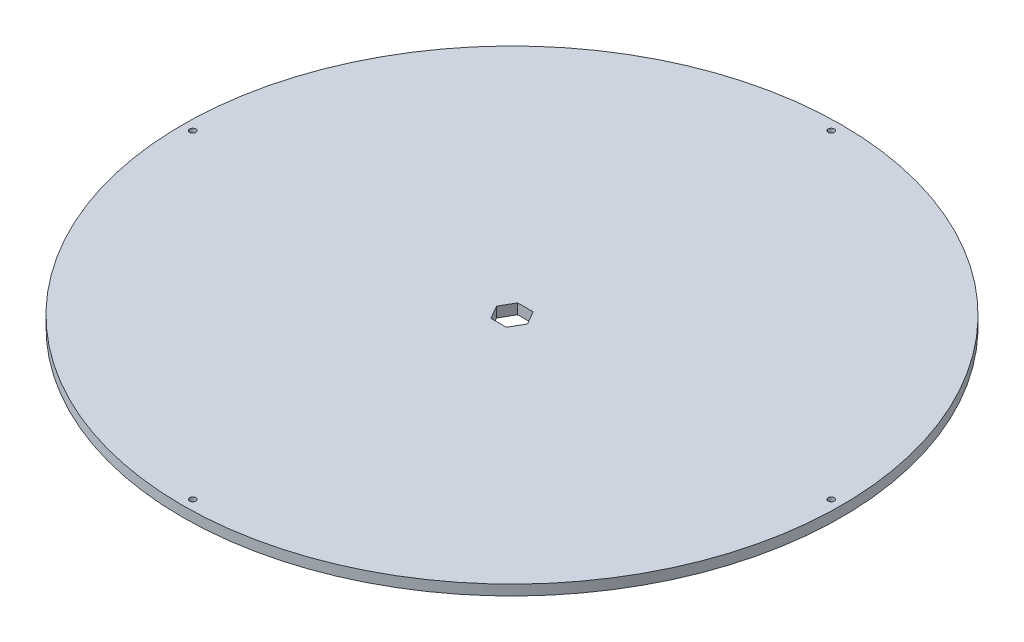
ISO-10303-21;
HEADER;
FILE_DESCRIPTION(('STEP AP214'),'2;1');
FILE_NAME('part.step','',(''),(''),'','','');
FILE_SCHEMA(('AUTOMOTIVE_DESIGN { 1 0 10303 214 1 1 1 1 }'));
ENDSEC;
DATA;
#1=APPLICATION_CONTEXT('core data for automotive mechanical design processes');
#2=APPLICATION_PROTOCOL_DEFINITION('international standard','automotive_design',2000,#1);
#3=PRODUCT_CONTEXT('',#1,'mechanical');
#4=PRODUCT('Part','Part','',(#3));
#5=PRODUCT_RELATED_PRODUCT_CATEGORY('part','',(#4));
#6=PRODUCT_DEFINITION_FORMATION('','',#4);
#7=PRODUCT_DEFINITION_CONTEXT('part definition',#1,'design');
#8=PRODUCT_DEFINITION('design','',#6,#7);
#9=PRODUCT_DEFINITION_SHAPE('','',#8);
#10=(LENGTH_UNIT() NAMED_UNIT(*) SI_UNIT(.MILLI.,.METRE.));
#11=(NAMED_UNIT(*) PLANE_ANGLE_UNIT() SI_UNIT($,.RADIAN.));
#12=(NAMED_UNIT(*) SI_UNIT($,.STERADIAN.) SOLID_ANGLE_UNIT());
#13=UNCERTAINTY_MEASURE_WITH_UNIT(LENGTH_MEASURE(1.E-05),#10,'distance_accuracy_value','');
#14=(GEOMETRIC_REPRESENTATION_CONTEXT(3) GLOBAL_UNCERTAINTY_ASSIGNED_CONTEXT((#13)) GLOBAL_UNIT_ASSIGNED_CONTEXT((#10,
#11,#12)) REPRESENTATION_CONTEXT('',''));
#15=CARTESIAN_POINT('',(0.,0.,0.));
#16=DIRECTION('',(0.,0.,1.));
#17=DIRECTION('',(1.,0.,0.));
#18=AXIS2_PLACEMENT_3D('',#15,#16,#17);
#19=CARTESIAN_POINT('',(0.,-5.,0.));
#20=DIRECTION('',(0.,1.,0.));
#21=DIRECTION('',(0.,0.,1.));
#22=AXIS2_PLACEMENT_3D('',#19,#20,#21);
#23=CYLINDRICAL_SURFACE('',#22,160.);
#24=CARTESIAN_POINT('',(0.,-5.,0.));
#25=DIRECTION('',(0.,1.,0.));
#26=DIRECTION('',(0.,0.,1.));
#27=AXIS2_PLACEMENT_3D('',#24,#25,#26);
#28=CIRCLE('',#27,160.);
#29=CARTESIAN_POINT('',(0.,-5.,160.));
#30=VERTEX_POINT('',#29);
#31=EDGE_CURVE('E11',#30,#30,#28,.T.);
#32=ORIENTED_EDGE('',*,*,#31,.T.);
#33=EDGE_LOOP('',(#32));
#34=FACE_BOUND('',#33,.T.);
#35=CARTESIAN_POINT('',(0.,0.,0.));
#36=DIRECTION('',(0.,1.,0.));
#37=DIRECTION('',(0.,0.,1.));
#38=AXIS2_PLACEMENT_3D('',#35,#36,#37);
#39=CIRCLE('',#38,160.);
#40=CARTESIAN_POINT('',(0.,0.,160.));
#41=VERTEX_POINT('',#40);
#42=EDGE_CURVE('E38',#41,#41,#39,.T.);
#43=ORIENTED_EDGE('',*,*,#42,.F.);
#44=EDGE_LOOP('',(#43));
#45=FACE_BOUND('',#44,.T.);
#46=ADVANCED_FACE('F35',(#34,#45),#23,.T.);
#47=CARTESIAN_POINT('',(0.,-5.,0.));
#48=DIRECTION('',(0.,1.,0.));
#49=DIRECTION('',(0.,0.,1.));
#50=AXIS2_PLACEMENT_3D('',#47,#48,#49);
#51=PLANE('',#50);
#52=CARTESIAN_POINT('',(1.62353882256206E-12,-5.,-155.));
#53=DIRECTION('',(0.,1.,0.));
#54=DIRECTION('',(0.,0.,1.));
#55=AXIS2_PLACEMENT_3D('',#52,#53,#54);
#56=CIRCLE('',#55,1.49999999999999);
#57=CARTESIAN_POINT('',(1.62353882256206E-12,-5.,-153.5));
#58=VERTEX_POINT('',#57);
#59=EDGE_CURVE('E210',#58,#58,#56,.T.);
#60=ORIENTED_EDGE('',*,*,#59,.T.);
#61=EDGE_LOOP('',(#60));
#62=FACE_BOUND('',#61,.T.);
#63=CARTESIAN_POINT('',(-155.,-5.,-1.08235921504137E-12));
#64=DIRECTION('',(0.,1.,0.));
#65=DIRECTION('',(0.,0.,1.));
#66=AXIS2_PLACEMENT_3D('',#63,#64,#65);
#67=CIRCLE('',#66,1.49999999999999);
#68=CARTESIAN_POINT('',(-155.,-5.,1.49999999999891));
#69=VERTEX_POINT('',#68);
#70=EDGE_CURVE('E218',#69,#69,#67,.T.);
#71=ORIENTED_EDGE('',*,*,#70,.T.);
#72=EDGE_LOOP('',(#71));
#73=FACE_BOUND('',#72,.T.);
#74=CARTESIAN_POINT('',(-5.41179607520686E-13,-5.,155.));
#75=DIRECTION('',(0.,1.,0.));
#76=DIRECTION('',(0.,0.,1.));
#77=AXIS2_PLACEMENT_3D('',#74,#75,#76);
#78=CIRCLE('',#77,1.5);
#79=CARTESIAN_POINT('',(-5.41179607520686E-13,-5.,156.5));
#80=VERTEX_POINT('',#79);
#81=EDGE_CURVE('E124',#80,#80,#78,.T.);
#82=ORIENTED_EDGE('',*,*,#81,.T.);
#83=EDGE_LOOP('',(#82));
#84=FACE_BOUND('',#83,.T.);
#85=DIRECTION('',(1.,0.,0.));
#86=VECTOR('',#85,1.);
#87=CARTESIAN_POINT('',(-3.75277674973257,-5.,6.5));
#88=LINE('',#87,#86);
#89=CARTESIAN_POINT('',(-3.75277674973257,-5.,6.5));
#90=VERTEX_POINT('',#89);
#91=CARTESIAN_POINT('',(3.75277674973256,-5.,6.5));
#92=VERTEX_POINT('',#91);
#93=EDGE_CURVE('E95',#90,#92,#88,.T.);
#94=ORIENTED_EDGE('',*,*,#93,.T.);
#95=DIRECTION('',(0.499999999999999,0.,-0.866025403784439));
#96=VECTOR('',#95,1.);
#97=CARTESIAN_POINT('',(3.75277674973256,-5.,6.5));
#98=LINE('',#97,#96);
#99=CARTESIAN_POINT('',(7.50555349946512,-5.,0.));
#100=VERTEX_POINT('',#99);
#101=EDGE_CURVE('E89',#92,#100,#98,.T.);
#102=ORIENTED_EDGE('',*,*,#101,.T.);
#103=DIRECTION('',(-0.5,0.,-0.866025403784439));
#104=VECTOR('',#103,1.);
#105=CARTESIAN_POINT('',(7.50555349946512,-5.,0.));
#106=LINE('',#105,#104);
#107=CARTESIAN_POINT('',(3.75277674973255,-5.,-6.50000000000001));
#108=VERTEX_POINT('',#107);
#109=EDGE_CURVE('E98',#100,#108,#106,.T.);
#110=ORIENTED_EDGE('',*,*,#109,.T.);
#111=DIRECTION('',(-1.,0.,0.));
#112=VECTOR('',#111,1.);
#113=CARTESIAN_POINT('',(3.75277674973255,-5.,-6.50000000000001));
#114=LINE('',#113,#112);
#115=CARTESIAN_POINT('',(-3.75277674973257,-5.,-6.50000000000002));
#116=VERTEX_POINT('',#115);
#117=EDGE_CURVE('E49',#108,#116,#114,.T.);
#118=ORIENTED_EDGE('',*,*,#117,.T.);
#119=DIRECTION('',(-0.5,0.,0.866025403784439));
#120=VECTOR('',#119,1.);
#121=CARTESIAN_POINT('',(-3.75277674973257,-5.,-6.50000000000002));
#122=LINE('',#121,#120);
#123=CARTESIAN_POINT('',(-7.50555349946514,-5.,0.));
#124=VERTEX_POINT('',#123);
#125=EDGE_CURVE('E116',#116,#124,#122,.T.);
#126=ORIENTED_EDGE('',*,*,#125,.T.);
#127=DIRECTION('',(0.5,0.,0.866025403784438));
#128=VECTOR('',#127,1.);
#129=CARTESIAN_POINT('',(-7.50555349946514,-5.,0.));
#130=LINE('',#129,#128);
#131=EDGE_CURVE('E119',#124,#90,#130,.T.);
#132=ORIENTED_EDGE('',*,*,#131,.T.);
#133=EDGE_LOOP('',(#94,#102,#110,#118,#126,#132));
#134=FACE_BOUND('',#133,.T.);
#135=CARTESIAN_POINT('',(155.,-5.,0.));
#136=DIRECTION('',(0.,1.,0.));
#137=DIRECTION('',(0.,0.,1.));
#138=AXIS2_PLACEMENT_3D('',#135,#136,#137);
#139=CIRCLE('',#138,1.5);
#140=CARTESIAN_POINT('',(155.,-5.,1.5));
#141=VERTEX_POINT('',#140);
#142=EDGE_CURVE('E144',#141,#141,#139,.T.);
#143=ORIENTED_EDGE('',*,*,#142,.T.);
#144=EDGE_LOOP('',(#143));
#145=FACE_BOUND('',#144,.T.);
#146=ORIENTED_EDGE('',*,*,#31,.F.);
#147=EDGE_LOOP('',(#146));
#148=FACE_BOUND('',#147,.T.);
#149=ADVANCED_FACE('F102',(#62,#73,#84,#134,#145,#148),#51,.F.);
#150=CARTESIAN_POINT('',(0.,0.,0.));
#151=DIRECTION('',(0.,1.,0.));
#152=DIRECTION('',(0.,0.,1.));
#153=AXIS2_PLACEMENT_3D('',#150,#151,#152);
#154=PLANE('',#153);
#155=CARTESIAN_POINT('',(1.62353882256206E-12,0.,-155.));
#156=DIRECTION('',(0.,1.,0.));
#157=DIRECTION('',(0.,0.,1.));
#158=AXIS2_PLACEMENT_3D('',#155,#156,#157);
#159=CIRCLE('',#158,1.49999999999999);
#160=CARTESIAN_POINT('',(1.62353882256206E-12,0.,-153.5));
#161=VERTEX_POINT('',#160);
#162=EDGE_CURVE('E213',#161,#161,#159,.T.);
#163=ORIENTED_EDGE('',*,*,#162,.F.);
#164=EDGE_LOOP('',(#163));
#165=FACE_BOUND('',#164,.T.);
#166=CARTESIAN_POINT('',(-155.,0.,-1.08235921504137E-12));
#167=DIRECTION('',(0.,1.,0.));
#168=DIRECTION('',(0.,0.,1.));
#169=AXIS2_PLACEMENT_3D('',#166,#167,#168);
#170=CIRCLE('',#169,1.49999999999999);
#171=CARTESIAN_POINT('',(-155.,0.,1.49999999999891));
#172=VERTEX_POINT('',#171);
#173=EDGE_CURVE('E215',#172,#172,#170,.T.);
#174=ORIENTED_EDGE('',*,*,#173,.F.);
#175=EDGE_LOOP('',(#174));
#176=FACE_BOUND('',#175,.T.);
#177=CARTESIAN_POINT('',(-5.41179607520686E-13,0.,155.));
#178=DIRECTION('',(0.,1.,0.));
#179=DIRECTION('',(0.,0.,1.));
#180=AXIS2_PLACEMENT_3D('',#177,#178,#179);
#181=CIRCLE('',#180,1.5);
#182=CARTESIAN_POINT('',(-5.41179607520686E-13,0.,156.5));
#183=VERTEX_POINT('',#182);
#184=EDGE_CURVE('E112',#183,#183,#181,.T.);
#185=ORIENTED_EDGE('',*,*,#184,.F.);
#186=EDGE_LOOP('',(#185));
#187=FACE_BOUND('',#186,.T.);
#188=DIRECTION('',(0.499999999999999,0.,-0.866025403784439));
#189=VECTOR('',#188,1.);
#190=CARTESIAN_POINT('',(3.75277674973256,0.,6.5));
#191=LINE('',#190,#189);
#192=CARTESIAN_POINT('',(3.75277674973256,0.,6.5));
#193=VERTEX_POINT('',#192);
#194=CARTESIAN_POINT('',(7.50555349946512,0.,0.));
#195=VERTEX_POINT('',#194);
#196=EDGE_CURVE('E57',#193,#195,#191,.T.);
#197=ORIENTED_EDGE('',*,*,#196,.F.);
#198=DIRECTION('',(1.,0.,0.));
#199=VECTOR('',#198,1.);
#200=CARTESIAN_POINT('',(-3.75277674973257,0.,6.5));
#201=LINE('',#200,#199);
#202=CARTESIAN_POINT('',(-3.75277674973257,0.,6.5));
#203=VERTEX_POINT('',#202);
#204=EDGE_CURVE('E106',#203,#193,#201,.T.);
#205=ORIENTED_EDGE('',*,*,#204,.F.);
#206=DIRECTION('',(0.5,0.,0.866025403784438));
#207=VECTOR('',#206,1.);
#208=CARTESIAN_POINT('',(-7.50555349946514,0.,0.));
#209=LINE('',#208,#207);
#210=CARTESIAN_POINT('',(-7.50555349946514,0.,0.));
#211=VERTEX_POINT('',#210);
#212=EDGE_CURVE('E109',#211,#203,#209,.T.);
#213=ORIENTED_EDGE('',*,*,#212,.F.);
#214=DIRECTION('',(-0.5,0.,0.866025403784439));
#215=VECTOR('',#214,1.);
#216=CARTESIAN_POINT('',(-3.75277674973257,0.,-6.50000000000002));
#217=LINE('',#216,#215);
#218=CARTESIAN_POINT('',(-3.75277674973257,0.,-6.50000000000002));
#219=VERTEX_POINT('',#218);
#220=EDGE_CURVE('E129',#219,#211,#217,.T.);
#221=ORIENTED_EDGE('',*,*,#220,.F.);
#222=DIRECTION('',(-1.,0.,0.));
#223=VECTOR('',#222,1.);
#224=CARTESIAN_POINT('',(3.75277674973255,0.,-6.50000000000001));
#225=LINE('',#224,#223);
#226=CARTESIAN_POINT('',(3.75277674973255,0.,-6.50000000000001));
#227=VERTEX_POINT('',#226);
#228=EDGE_CURVE('E126',#227,#219,#225,.T.);
#229=ORIENTED_EDGE('',*,*,#228,.F.);
#230=DIRECTION('',(-0.5,0.,-0.866025403784439));
#231=VECTOR('',#230,1.);
#232=CARTESIAN_POINT('',(7.50555349946512,0.,0.));
#233=LINE('',#232,#231);
#234=EDGE_CURVE('E123',#195,#227,#233,.T.);
#235=ORIENTED_EDGE('',*,*,#234,.F.);
#236=EDGE_LOOP('',(#197,#205,#213,#221,#229,#235));
#237=FACE_BOUND('',#236,.T.);
#238=CARTESIAN_POINT('',(155.,0.,0.));
#239=DIRECTION('',(0.,1.,0.));
#240=DIRECTION('',(0.,0.,1.));
#241=AXIS2_PLACEMENT_3D('',#238,#239,#240);
#242=CIRCLE('',#241,1.5);
#243=CARTESIAN_POINT('',(155.,0.,1.5));
#244=VERTEX_POINT('',#243);
#245=EDGE_CURVE('E136',#244,#244,#242,.T.);
#246=ORIENTED_EDGE('',*,*,#245,.F.);
#247=EDGE_LOOP('',(#246));
#248=FACE_BOUND('',#247,.T.);
#249=ORIENTED_EDGE('',*,*,#42,.T.);
#250=EDGE_LOOP('',(#249));
#251=FACE_BOUND('',#250,.T.);
#252=ADVANCED_FACE('F152',(#165,#176,#187,#237,#248,#251),#154,.T.);
#253=CARTESIAN_POINT('',(155.,-5.,0.));
#254=DIRECTION('',(0.,1.,0.));
#255=DIRECTION('',(0.,0.,1.));
#256=AXIS2_PLACEMENT_3D('',#253,#254,#255);
#257=CYLINDRICAL_SURFACE('',#256,1.5);
#258=ORIENTED_EDGE('',*,*,#142,.F.);
#259=EDGE_LOOP('',(#258));
#260=FACE_BOUND('',#259,.T.);
#261=ORIENTED_EDGE('',*,*,#245,.T.);
#262=EDGE_LOOP('',(#261));
#263=FACE_BOUND('',#262,.T.);
#264=ADVANCED_FACE('F150',(#260,#263),#257,.F.);
#265=CARTESIAN_POINT('',(3.75277674973256,-5.,6.5));
#266=DIRECTION('',(0.866025403784439,0.,0.499999999999999));
#267=DIRECTION('',(0.499999999999999,0.,-0.866025403784439));
#268=AXIS2_PLACEMENT_3D('',#265,#266,#267);
#269=PLANE('',#268);
#270=ORIENTED_EDGE('',*,*,#196,.T.);
#271=DIRECTION('',(0.,1.,0.));
#272=VECTOR('',#271,1.);
#273=CARTESIAN_POINT('',(7.50555349946512,-5.,0.));
#274=LINE('',#273,#272);
#275=EDGE_CURVE('E85',#100,#195,#274,.T.);
#276=ORIENTED_EDGE('',*,*,#275,.F.);
#277=ORIENTED_EDGE('',*,*,#101,.F.);
#278=DIRECTION('',(0.,1.,0.));
#279=VECTOR('',#278,1.);
#280=CARTESIAN_POINT('',(3.75277674973256,-5.,6.5));
#281=LINE('',#280,#279);
#282=EDGE_CURVE('E134',#92,#193,#281,.T.);
#283=ORIENTED_EDGE('',*,*,#282,.T.);
#284=EDGE_LOOP('',(#270,#276,#277,#283));
#285=FACE_BOUND('',#284,.T.);
#286=ADVANCED_FACE('F87',(#285),#269,.F.);
#287=CARTESIAN_POINT('',(-3.75277674973257,-5.,6.5));
#288=DIRECTION('',(0.,0.,1.));
#289=DIRECTION('',(1.,0.,0.));
#290=AXIS2_PLACEMENT_3D('',#287,#288,#289);
#291=PLANE('',#290);
#292=ORIENTED_EDGE('',*,*,#204,.T.);
#293=ORIENTED_EDGE('',*,*,#282,.F.);
#294=ORIENTED_EDGE('',*,*,#93,.F.);
#295=DIRECTION('',(0.,1.,0.));
#296=VECTOR('',#295,1.);
#297=CARTESIAN_POINT('',(-3.75277674973257,-5.,6.5));
#298=LINE('',#297,#296);
#299=EDGE_CURVE('E137',#90,#203,#298,.T.);
#300=ORIENTED_EDGE('',*,*,#299,.T.);
#301=EDGE_LOOP('',(#292,#293,#294,#300));
#302=FACE_BOUND('',#301,.T.);
#303=ADVANCED_FACE('F178',(#302),#291,.F.);
#304=CARTESIAN_POINT('',(-7.50555349946514,-5.,0.));
#305=DIRECTION('',(-0.866025403784439,0.,0.5));
#306=DIRECTION('',(0.5,0.,0.866025403784439));
#307=AXIS2_PLACEMENT_3D('',#304,#305,#306);
#308=PLANE('',#307);
#309=ORIENTED_EDGE('',*,*,#212,.T.);
#310=ORIENTED_EDGE('',*,*,#299,.F.);
#311=ORIENTED_EDGE('',*,*,#131,.F.);
#312=DIRECTION('',(0.,1.,0.));
#313=VECTOR('',#312,1.);
#314=CARTESIAN_POINT('',(-7.50555349946514,-5.,0.));
#315=LINE('',#314,#313);
#316=EDGE_CURVE('E139',#124,#211,#315,.T.);
#317=ORIENTED_EDGE('',*,*,#316,.T.);
#318=EDGE_LOOP('',(#309,#310,#311,#317));
#319=FACE_BOUND('',#318,.T.);
#320=ADVANCED_FACE('F188',(#319),#308,.F.);
#321=CARTESIAN_POINT('',(-3.75277674973257,-5.,-6.50000000000002));
#322=DIRECTION('',(-0.866025403784439,0.,-0.5));
#323=DIRECTION('',(-0.5,0.,0.866025403784439));
#324=AXIS2_PLACEMENT_3D('',#321,#322,#323);
#325=PLANE('',#324);
#326=ORIENTED_EDGE('',*,*,#220,.T.);
#327=ORIENTED_EDGE('',*,*,#316,.F.);
#328=ORIENTED_EDGE('',*,*,#125,.F.);
#329=DIRECTION('',(0.,1.,0.));
#330=VECTOR('',#329,1.);
#331=CARTESIAN_POINT('',(-3.75277674973257,-5.,-6.50000000000002));
#332=LINE('',#331,#330);
#333=EDGE_CURVE('E141',#116,#219,#332,.T.);
#334=ORIENTED_EDGE('',*,*,#333,.T.);
#335=EDGE_LOOP('',(#326,#327,#328,#334));
#336=FACE_BOUND('',#335,.T.);
#337=ADVANCED_FACE('F185',(#336),#325,.F.);
#338=CARTESIAN_POINT('',(3.75277674973255,-5.,-6.50000000000001));
#339=DIRECTION('',(0.,0.,-1.));
#340=DIRECTION('',(-1.,0.,0.));
#341=AXIS2_PLACEMENT_3D('',#338,#339,#340);
#342=PLANE('',#341);
#343=ORIENTED_EDGE('',*,*,#228,.T.);
#344=ORIENTED_EDGE('',*,*,#333,.F.);
#345=ORIENTED_EDGE('',*,*,#117,.F.);
#346=DIRECTION('',(0.,1.,0.));
#347=VECTOR('',#346,1.);
#348=CARTESIAN_POINT('',(3.75277674973255,-5.,-6.50000000000001));
#349=LINE('',#348,#347);
#350=EDGE_CURVE('E94',#108,#227,#349,.T.);
#351=ORIENTED_EDGE('',*,*,#350,.T.);
#352=EDGE_LOOP('',(#343,#344,#345,#351));
#353=FACE_BOUND('',#352,.T.);
#354=ADVANCED_FACE('F182',(#353),#342,.F.);
#355=CARTESIAN_POINT('',(7.50555349946512,-5.,0.));
#356=DIRECTION('',(0.866025403784439,0.,-0.5));
#357=DIRECTION('',(-0.5,0.,-0.866025403784439));
#358=AXIS2_PLACEMENT_3D('',#355,#356,#357);
#359=PLANE('',#358);
#360=ORIENTED_EDGE('',*,*,#234,.T.);
#361=ORIENTED_EDGE('',*,*,#350,.F.);
#362=ORIENTED_EDGE('',*,*,#109,.F.);
#363=ORIENTED_EDGE('',*,*,#275,.T.);
#364=EDGE_LOOP('',(#360,#361,#362,#363));
#365=FACE_BOUND('',#364,.T.);
#366=ADVANCED_FACE('F99',(#365),#359,.F.);
#367=CARTESIAN_POINT('',(-5.41179607520686E-13,-5.,155.));
#368=DIRECTION('',(0.,1.,0.));
#369=DIRECTION('',(0.,0.,1.));
#370=AXIS2_PLACEMENT_3D('',#367,#368,#369);
#371=CYLINDRICAL_SURFACE('',#370,1.5);
#372=ORIENTED_EDGE('',*,*,#81,.F.);
#373=EDGE_LOOP('',(#372));
#374=FACE_BOUND('',#373,.T.);
#375=ORIENTED_EDGE('',*,*,#184,.T.);
#376=EDGE_LOOP('',(#375));
#377=FACE_BOUND('',#376,.T.);
#378=ADVANCED_FACE('F181',(#374,#377),#371,.F.);
#379=CARTESIAN_POINT('',(-155.,-5.,-1.08235921504137E-12));
#380=DIRECTION('',(0.,1.,0.));
#381=DIRECTION('',(0.,0.,1.));
#382=AXIS2_PLACEMENT_3D('',#379,#380,#381);
#383=CYLINDRICAL_SURFACE('',#382,1.49999999999999);
#384=ORIENTED_EDGE('',*,*,#70,.F.);
#385=EDGE_LOOP('',(#384));
#386=FACE_BOUND('',#385,.T.);
#387=ORIENTED_EDGE('',*,*,#173,.T.);
#388=EDGE_LOOP('',(#387));
#389=FACE_BOUND('',#388,.T.);
#390=ADVANCED_FACE('F198',(#386,#389),#383,.F.);
#391=CARTESIAN_POINT('',(1.62353882256206E-12,-5.,-155.));
#392=DIRECTION('',(0.,1.,0.));
#393=DIRECTION('',(0.,0.,1.));
#394=AXIS2_PLACEMENT_3D('',#391,#392,#393);
#395=CYLINDRICAL_SURFACE('',#394,1.49999999999999);
#396=ORIENTED_EDGE('',*,*,#59,.F.);
#397=EDGE_LOOP('',(#396));
#398=FACE_BOUND('',#397,.T.);
#399=ORIENTED_EDGE('',*,*,#162,.T.);
#400=EDGE_LOOP('',(#399));
#401=FACE_BOUND('',#400,.T.);
#402=ADVANCED_FACE('F202',(#398,#401),#395,.F.);
#403=CLOSED_SHELL('',(#46,#149,#252,#264,#286,#303,#320,#337,#354,#366,#378,#390,#402));
#404=MANIFOLD_SOLID_BREP('B2',#403);
#405=ADVANCED_BREP_SHAPE_REPRESENTATION('',(#18,#404),#14);
#406=SHAPE_DEFINITION_REPRESENTATION(#9,#405);
ENDSEC;
END-ISO-10303-21;
